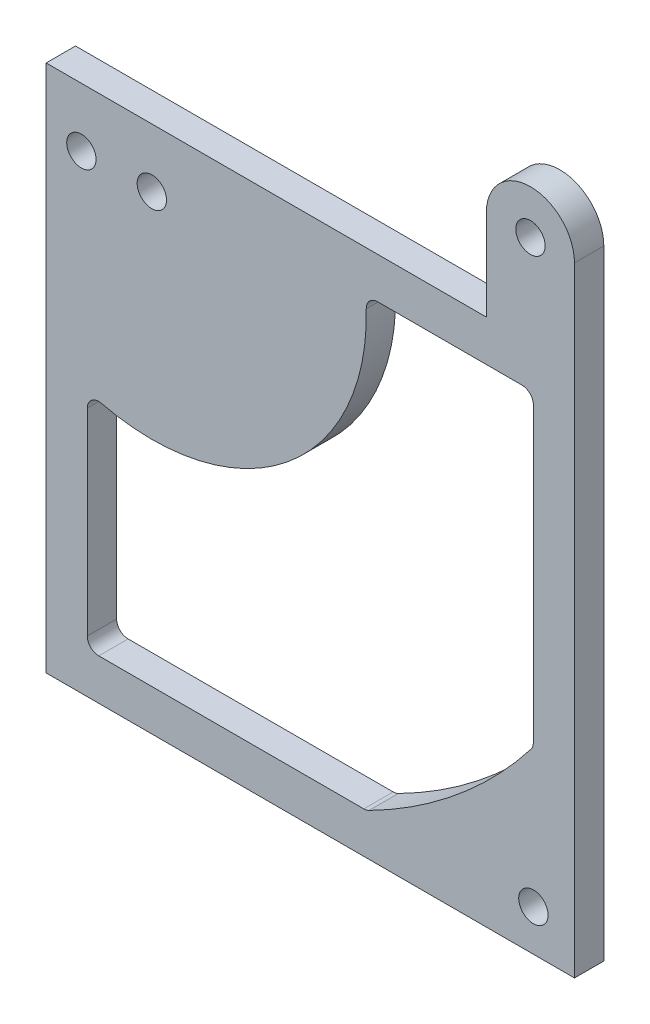
ISO-10303-21;
HEADER;
FILE_DESCRIPTION(('STEP AP214'),'2;1');
FILE_NAME('part.step','',(''),(''),'','','');
FILE_SCHEMA(('AUTOMOTIVE_DESIGN { 1 0 10303 214 1 1 1 1 }'));
ENDSEC;
DATA;
#1=APPLICATION_CONTEXT('core data for automotive mechanical design processes');
#2=APPLICATION_PROTOCOL_DEFINITION('international standard','automotive_design',2000,#1);
#3=PRODUCT_CONTEXT('',#1,'mechanical');
#4=PRODUCT('Part','Part','',(#3));
#5=PRODUCT_RELATED_PRODUCT_CATEGORY('part','',(#4));
#6=PRODUCT_DEFINITION_FORMATION('','',#4);
#7=PRODUCT_DEFINITION_CONTEXT('part definition',#1,'design');
#8=PRODUCT_DEFINITION('design','',#6,#7);
#9=PRODUCT_DEFINITION_SHAPE('','',#8);
#10=(LENGTH_UNIT() NAMED_UNIT(*) SI_UNIT(.MILLI.,.METRE.));
#11=(NAMED_UNIT(*) PLANE_ANGLE_UNIT() SI_UNIT($,.RADIAN.));
#12=(NAMED_UNIT(*) SI_UNIT($,.STERADIAN.) SOLID_ANGLE_UNIT());
#13=UNCERTAINTY_MEASURE_WITH_UNIT(LENGTH_MEASURE(1.E-05),#10,'distance_accuracy_value','');
#14=(GEOMETRIC_REPRESENTATION_CONTEXT(3) GLOBAL_UNCERTAINTY_ASSIGNED_CONTEXT((#13)) GLOBAL_UNIT_ASSIGNED_CONTEXT((#10,
#11,#12)) REPRESENTATION_CONTEXT('',''));
#15=CARTESIAN_POINT('',(0.,0.,0.));
#16=DIRECTION('',(0.,0.,1.));
#17=DIRECTION('',(1.,0.,0.));
#18=AXIS2_PLACEMENT_3D('',#15,#16,#17);
#19=CARTESIAN_POINT('',(47.625,76.835,3.175));
#20=DIRECTION('',(0.,0.,-1.));
#21=DIRECTION('',(-1.,0.,0.));
#22=AXIS2_PLACEMENT_3D('',#19,#20,#21);
#23=PLANE('',#22);
#24=CARTESIAN_POINT('',(-49.53,44.45,3.175));
#25=DIRECTION('',(0.,0.,1.));
#26=DIRECTION('',(1.,0.,0.));
#27=AXIS2_PLACEMENT_3D('',#24,#25,#26);
#28=CIRCLE('',#27,3.17499999999997);
#29=CARTESIAN_POINT('',(-46.355,44.45,3.175));
#30=VERTEX_POINT('',#29);
#31=EDGE_CURVE('E333',#30,#30,#28,.T.);
#32=ORIENTED_EDGE('',*,*,#31,.F.);
#33=EDGE_LOOP('',(#32));
#34=FACE_BOUND('',#33,.T.);
#35=CARTESIAN_POINT('',(-34.29,44.45,3.175));
#36=DIRECTION('',(0.,0.,1.));
#37=DIRECTION('',(1.,0.,0.));
#38=AXIS2_PLACEMENT_3D('',#35,#36,#37);
#39=CIRCLE('',#38,3.175);
#40=CARTESIAN_POINT('',(-31.115,44.45,3.175));
#41=VERTEX_POINT('',#40);
#42=EDGE_CURVE('E326',#41,#41,#39,.T.);
#43=ORIENTED_EDGE('',*,*,#42,.F.);
#44=EDGE_LOOP('',(#43));
#45=FACE_BOUND('',#44,.T.);
#46=CARTESIAN_POINT('',(47.625,76.835,3.175));
#47=DIRECTION('',(0.,0.,1.));
#48=DIRECTION('',(-1.,0.,0.));
#49=AXIS2_PLACEMENT_3D('',#46,#47,#48);
#50=CIRCLE('',#49,9.525);
#51=CARTESIAN_POINT('',(57.15,76.835,3.175));
#52=VERTEX_POINT('',#51);
#53=CARTESIAN_POINT('',(38.1,76.835,3.175));
#54=VERTEX_POINT('',#53);
#55=EDGE_CURVE('E292',#52,#54,#50,.T.);
#56=ORIENTED_EDGE('',*,*,#55,.T.);
#57=DIRECTION('',(0.,-1.,0.));
#58=VECTOR('',#57,1.);
#59=CARTESIAN_POINT('',(38.1,76.835,3.175));
#60=LINE('',#59,#58);
#61=CARTESIAN_POINT('',(38.1,57.15,3.175));
#62=VERTEX_POINT('',#61);
#63=EDGE_CURVE('E311',#54,#62,#60,.T.);
#64=ORIENTED_EDGE('',*,*,#63,.T.);
#65=DIRECTION('',(-1.,0.,0.));
#66=VECTOR('',#65,1.);
#67=CARTESIAN_POINT('',(-57.15,57.15,3.175));
#68=LINE('',#67,#66);
#69=CARTESIAN_POINT('',(-57.15,57.15,3.175));
#70=VERTEX_POINT('',#69);
#71=EDGE_CURVE('E278',#62,#70,#68,.T.);
#72=ORIENTED_EDGE('',*,*,#71,.T.);
#73=DIRECTION('',(0.,-1.,0.));
#74=VECTOR('',#73,1.);
#75=CARTESIAN_POINT('',(-57.15,-57.15,3.175));
#76=LINE('',#75,#74);
#77=CARTESIAN_POINT('',(-57.15,-57.15,3.175));
#78=VERTEX_POINT('',#77);
#79=EDGE_CURVE('E305',#70,#78,#76,.T.);
#80=ORIENTED_EDGE('',*,*,#79,.T.);
#81=DIRECTION('',(1.,0.,0.));
#82=VECTOR('',#81,1.);
#83=CARTESIAN_POINT('',(-57.15,-57.15,3.175));
#84=LINE('',#83,#82);
#85=CARTESIAN_POINT('',(57.15,-57.15,3.175));
#86=VERTEX_POINT('',#85);
#87=EDGE_CURVE('E308',#78,#86,#84,.T.);
#88=ORIENTED_EDGE('',*,*,#87,.T.);
#89=DIRECTION('',(0.,1.,0.));
#90=VECTOR('',#89,1.);
#91=CARTESIAN_POINT('',(57.15,-57.15,3.175));
#92=LINE('',#91,#90);
#93=EDGE_CURVE('E297',#86,#52,#92,.T.);
#94=ORIENTED_EDGE('',*,*,#93,.T.);
#95=EDGE_LOOP('',(#56,#64,#72,#80,#88,#94));
#96=FACE_BOUND('',#95,.T.);
#97=CARTESIAN_POINT('',(-45.7715239103202,-3.07659926776489,3.175));
#98=DIRECTION('',(0.,0.,1.));
#99=DIRECTION('',(1.,0.,0.));
#100=AXIS2_PLACEMENT_3D('',#97,#98,#99);
#101=CIRCLE('',#100,2.48847608967975);
#102=CARTESIAN_POINT('',(-45.1871655335266,-0.657707261829316,3.175));
#103=VERTEX_POINT('',#102);
#104=CARTESIAN_POINT('',(-48.26,-3.07659926776489,3.175));
#105=VERTEX_POINT('',#104);
#106=EDGE_CURVE('E165',#103,#105,#101,.T.);
#107=ORIENTED_EDGE('',*,*,#106,.F.);
#108=CARTESIAN_POINT('',(-34.29,44.45,3.175));
#109=DIRECTION('',(0.,0.,-1.));
#110=DIRECTION('',(1.,0.,0.));
#111=AXIS2_PLACEMENT_3D('',#108,#109,#110);
#112=CIRCLE('',#111,46.4053172716659);
#113=CARTESIAN_POINT('',(12.0983637598057,45.704264235284,3.175));
#114=VERTEX_POINT('',#113);
#115=EDGE_CURVE('E372',#114,#103,#112,.T.);
#116=ORIENTED_EDGE('',*,*,#115,.F.);
#117=CARTESIAN_POINT('',(14.5859307207179,45.7715239103202,3.175));
#118=DIRECTION('',(0.,0.,1.));
#119=DIRECTION('',(-1.,0.,0.));
#120=AXIS2_PLACEMENT_3D('',#117,#118,#119);
#121=CIRCLE('',#120,2.48847608967976);
#122=CARTESIAN_POINT('',(14.5859307207179,48.26,3.175));
#123=VERTEX_POINT('',#122);
#124=EDGE_CURVE('E406',#123,#114,#121,.T.);
#125=ORIENTED_EDGE('',*,*,#124,.F.);
#126=DIRECTION('',(-1.,0.,0.));
#127=VECTOR('',#126,1.);
#128=CARTESIAN_POINT('',(14.5859307207179,48.26,3.175));
#129=LINE('',#128,#127);
#130=CARTESIAN_POINT('',(45.7715239103202,48.26,3.175));
#131=VERTEX_POINT('',#130);
#132=EDGE_CURVE('E414',#131,#123,#129,.T.);
#133=ORIENTED_EDGE('',*,*,#132,.F.);
#134=CARTESIAN_POINT('',(45.7715239103202,45.7715239103202,3.175));
#135=DIRECTION('',(0.,0.,1.));
#136=DIRECTION('',(-1.,0.,0.));
#137=AXIS2_PLACEMENT_3D('',#134,#135,#136);
#138=CIRCLE('',#137,2.48847608967976);
#139=CARTESIAN_POINT('',(48.2599999999999,45.7715239103202,3.175));
#140=VERTEX_POINT('',#139);
#141=EDGE_CURVE('E416',#140,#131,#138,.T.);
#142=ORIENTED_EDGE('',*,*,#141,.F.);
#143=DIRECTION('',(0.,1.,0.));
#144=VECTOR('',#143,1.);
#145=CARTESIAN_POINT('',(48.26,-17.4505972638445,3.175));
#146=LINE('',#145,#144);
#147=CARTESIAN_POINT('',(48.26,-17.4505972638445,3.175));
#148=VERTEX_POINT('',#147);
#149=EDGE_CURVE('E419',#148,#140,#146,.T.);
#150=ORIENTED_EDGE('',*,*,#149,.F.);
#151=CARTESIAN_POINT('',(45.7715239103202,-17.4505972638445,3.175));
#152=DIRECTION('',(0.,0.,1.));
#153=DIRECTION('',(-1.,0.,0.));
#154=AXIS2_PLACEMENT_3D('',#151,#152,#153);
#155=CIRCLE('',#154,2.48847608967975);
#156=CARTESIAN_POINT('',(47.7402027389286,-18.9727066287381,3.175));
#157=VERTEX_POINT('',#156);
#158=EDGE_CURVE('E422',#157,#148,#155,.T.);
#159=ORIENTED_EDGE('',*,*,#158,.F.);
#160=CARTESIAN_POINT('',(-34.29,44.45,3.175));
#161=DIRECTION('',(0.,0.,1.));
#162=DIRECTION('',(1.,0.,0.));
#163=AXIS2_PLACEMENT_3D('',#160,#161,#162);
#164=CIRCLE('',#163,103.688928422974);
#165=CARTESIAN_POINT('',(12.6995451600385,-47.9803874445921,3.175));
#166=VERTEX_POINT('',#165);
#167=EDGE_CURVE('E429',#166,#157,#164,.T.);
#168=ORIENTED_EDGE('',*,*,#167,.F.);
#169=CARTESIAN_POINT('',(11.5718224477477,-45.7621100198566,3.175));
#170=DIRECTION('',(0.,0.,1.));
#171=DIRECTION('',(-1.,0.,0.));
#172=AXIS2_PLACEMENT_3D('',#169,#170,#171);
#173=CIRCLE('',#172,2.48847608967976);
#174=CARTESIAN_POINT('',(11.5718224477477,-48.2505861095364,3.175));
#175=VERTEX_POINT('',#174);
#176=EDGE_CURVE('E431',#175,#166,#173,.T.);
#177=ORIENTED_EDGE('',*,*,#176,.F.);
#178=DIRECTION('',(1.,0.,0.));
#179=VECTOR('',#178,1.);
#180=CARTESIAN_POINT('',(-45.7715239103202,-48.2505861095364,3.175));
#181=LINE('',#180,#179);
#182=CARTESIAN_POINT('',(-45.7715239103202,-48.2505861095364,3.175));
#183=VERTEX_POINT('',#182);
#184=EDGE_CURVE('E189',#183,#175,#181,.T.);
#185=ORIENTED_EDGE('',*,*,#184,.F.);
#186=CARTESIAN_POINT('',(-45.7715239103202,-45.7621100198566,3.175));
#187=DIRECTION('',(0.,0.,1.));
#188=DIRECTION('',(-1.,0.,0.));
#189=AXIS2_PLACEMENT_3D('',#186,#187,#188);
#190=CIRCLE('',#189,2.48847608967976);
#191=CARTESIAN_POINT('',(-48.26,-45.7621100198566,3.175));
#192=VERTEX_POINT('',#191);
#193=EDGE_CURVE('E187',#192,#183,#190,.T.);
#194=ORIENTED_EDGE('',*,*,#193,.F.);
#195=DIRECTION('',(0.,-1.,0.));
#196=VECTOR('',#195,1.);
#197=CARTESIAN_POINT('',(-48.26,-45.7621100198566,3.175));
#198=LINE('',#197,#196);
#199=EDGE_CURVE('E173',#105,#192,#198,.T.);
#200=ORIENTED_EDGE('',*,*,#199,.F.);
#201=EDGE_LOOP('',(#107,#116,#125,#133,#142,#150,#159,#168,#177,#185,#194,#200));
#202=FACE_BOUND('',#201,.T.);
#203=CARTESIAN_POINT('',(48.26,-48.2505861095364,3.175));
#204=DIRECTION('',(0.,0.,1.));
#205=DIRECTION('',(1.,0.,0.));
#206=AXIS2_PLACEMENT_3D('',#203,#204,#205);
#207=CIRCLE('',#206,3.17499999999999);
#208=CARTESIAN_POINT('',(51.435,-48.2505861095364,3.175));
#209=VERTEX_POINT('',#208);
#210=EDGE_CURVE('E200',#209,#209,#207,.T.);
#211=ORIENTED_EDGE('',*,*,#210,.F.);
#212=EDGE_LOOP('',(#211));
#213=FACE_BOUND('',#212,.T.);
#214=CARTESIAN_POINT('',(47.625,76.835,3.175));
#215=DIRECTION('',(0.,0.,1.));
#216=DIRECTION('',(1.,0.,0.));
#217=AXIS2_PLACEMENT_3D('',#214,#215,#216);
#218=CIRCLE('',#217,3.175);
#219=CARTESIAN_POINT('',(50.8,76.835,3.175));
#220=VERTEX_POINT('',#219);
#221=EDGE_CURVE('E207',#220,#220,#218,.T.);
#222=ORIENTED_EDGE('',*,*,#221,.F.);
#223=EDGE_LOOP('',(#222));
#224=FACE_BOUND('',#223,.T.);
#225=ADVANCED_FACE('F40',(#34,#45,#96,#202,#213,#224),#23,.F.);
#226=CARTESIAN_POINT('',(47.625,76.835,-3.175));
#227=DIRECTION('',(0.,0.,-1.));
#228=DIRECTION('',(-1.,0.,0.));
#229=AXIS2_PLACEMENT_3D('',#226,#227,#228);
#230=PLANE('',#229);
#231=CARTESIAN_POINT('',(48.26,-48.2505861095364,-3.175));
#232=DIRECTION('',(0.,0.,1.));
#233=DIRECTION('',(1.,0.,0.));
#234=AXIS2_PLACEMENT_3D('',#231,#232,#233);
#235=CIRCLE('',#234,3.17499999999999);
#236=CARTESIAN_POINT('',(51.435,-48.2505861095364,-3.175));
#237=VERTEX_POINT('',#236);
#238=EDGE_CURVE('E204',#237,#237,#235,.T.);
#239=ORIENTED_EDGE('',*,*,#238,.T.);
#240=EDGE_LOOP('',(#239));
#241=FACE_BOUND('',#240,.T.);
#242=CARTESIAN_POINT('',(-34.29,44.45,-3.175));
#243=DIRECTION('',(0.,0.,1.));
#244=DIRECTION('',(1.,0.,0.));
#245=AXIS2_PLACEMENT_3D('',#242,#243,#244);
#246=CIRCLE('',#245,3.175);
#247=CARTESIAN_POINT('',(-31.115,44.45,-3.175));
#248=VERTEX_POINT('',#247);
#249=EDGE_CURVE('E328',#248,#248,#246,.T.);
#250=ORIENTED_EDGE('',*,*,#249,.T.);
#251=EDGE_LOOP('',(#250));
#252=FACE_BOUND('',#251,.T.);
#253=CARTESIAN_POINT('',(47.625,76.835,-3.175));
#254=DIRECTION('',(0.,0.,1.));
#255=DIRECTION('',(-1.,0.,0.));
#256=AXIS2_PLACEMENT_3D('',#253,#254,#255);
#257=CIRCLE('',#256,9.525);
#258=CARTESIAN_POINT('',(57.15,76.835,-3.175));
#259=VERTEX_POINT('',#258);
#260=CARTESIAN_POINT('',(38.1,76.835,-3.175));
#261=VERTEX_POINT('',#260);
#262=EDGE_CURVE('E274',#259,#261,#257,.T.);
#263=ORIENTED_EDGE('',*,*,#262,.F.);
#264=DIRECTION('',(0.,1.,0.));
#265=VECTOR('',#264,1.);
#266=CARTESIAN_POINT('',(57.15,-57.15,-3.175));
#267=LINE('',#266,#265);
#268=CARTESIAN_POINT('',(57.15,-57.15,-3.175));
#269=VERTEX_POINT('',#268);
#270=EDGE_CURVE('E290',#269,#259,#267,.T.);
#271=ORIENTED_EDGE('',*,*,#270,.F.);
#272=DIRECTION('',(1.,0.,0.));
#273=VECTOR('',#272,1.);
#274=CARTESIAN_POINT('',(-57.15,-57.15,-3.175));
#275=LINE('',#274,#273);
#276=CARTESIAN_POINT('',(-57.15,-57.15,-3.175));
#277=VERTEX_POINT('',#276);
#278=EDGE_CURVE('E285',#277,#269,#275,.T.);
#279=ORIENTED_EDGE('',*,*,#278,.F.);
#280=DIRECTION('',(0.,-1.,0.));
#281=VECTOR('',#280,1.);
#282=CARTESIAN_POINT('',(-57.15,-57.15,-3.175));
#283=LINE('',#282,#281);
#284=CARTESIAN_POINT('',(-57.15,57.15,-3.175));
#285=VERTEX_POINT('',#284);
#286=EDGE_CURVE('E283',#285,#277,#283,.T.);
#287=ORIENTED_EDGE('',*,*,#286,.F.);
#288=DIRECTION('',(-1.,0.,0.));
#289=VECTOR('',#288,1.);
#290=CARTESIAN_POINT('',(-57.15,57.15,-3.175));
#291=LINE('',#290,#289);
#292=CARTESIAN_POINT('',(38.1,57.15,-3.175));
#293=VERTEX_POINT('',#292);
#294=EDGE_CURVE('E273',#293,#285,#291,.T.);
#295=ORIENTED_EDGE('',*,*,#294,.F.);
#296=DIRECTION('',(0.,-1.,0.));
#297=VECTOR('',#296,1.);
#298=CARTESIAN_POINT('',(38.1,76.835,-3.175));
#299=LINE('',#298,#297);
#300=EDGE_CURVE('E265',#261,#293,#299,.T.);
#301=ORIENTED_EDGE('',*,*,#300,.F.);
#302=EDGE_LOOP('',(#263,#271,#279,#287,#295,#301));
#303=FACE_BOUND('',#302,.T.);
#304=CARTESIAN_POINT('',(-49.53,44.45,-3.175));
#305=DIRECTION('',(0.,0.,1.));
#306=DIRECTION('',(1.,0.,0.));
#307=AXIS2_PLACEMENT_3D('',#304,#305,#306);
#308=CIRCLE('',#307,3.17499999999997);
#309=CARTESIAN_POINT('',(-46.355,44.45,-3.175));
#310=VERTEX_POINT('',#309);
#311=EDGE_CURVE('E181',#310,#310,#308,.T.);
#312=ORIENTED_EDGE('',*,*,#311,.T.);
#313=EDGE_LOOP('',(#312));
#314=FACE_BOUND('',#313,.T.);
#315=CARTESIAN_POINT('',(-34.29,44.45,-3.175));
#316=DIRECTION('',(0.,0.,-1.));
#317=DIRECTION('',(1.,0.,0.));
#318=AXIS2_PLACEMENT_3D('',#315,#316,#317);
#319=CIRCLE('',#318,46.4053172716659);
#320=CARTESIAN_POINT('',(12.0983637598057,45.704264235284,-3.175));
#321=VERTEX_POINT('',#320);
#322=CARTESIAN_POINT('',(-45.1871655335266,-0.657707261829316,-3.175));
#323=VERTEX_POINT('',#322);
#324=EDGE_CURVE('E174',#321,#323,#319,.T.);
#325=ORIENTED_EDGE('',*,*,#324,.T.);
#326=CARTESIAN_POINT('',(-45.7715239103202,-3.07659926776489,-3.175));
#327=DIRECTION('',(0.,0.,1.));
#328=DIRECTION('',(1.,0.,0.));
#329=AXIS2_PLACEMENT_3D('',#326,#327,#328);
#330=CIRCLE('',#329,2.48847608967975);
#331=CARTESIAN_POINT('',(-48.26,-3.07659926776489,-3.175));
#332=VERTEX_POINT('',#331);
#333=EDGE_CURVE('E63',#323,#332,#330,.T.);
#334=ORIENTED_EDGE('',*,*,#333,.T.);
#335=DIRECTION('',(0.,-1.,0.));
#336=VECTOR('',#335,1.);
#337=CARTESIAN_POINT('',(-48.26,-45.7621100198566,-3.175));
#338=LINE('',#337,#336);
#339=CARTESIAN_POINT('',(-48.26,-45.7621100198566,-3.175));
#340=VERTEX_POINT('',#339);
#341=EDGE_CURVE('E180',#332,#340,#338,.T.);
#342=ORIENTED_EDGE('',*,*,#341,.T.);
#343=CARTESIAN_POINT('',(-45.7715239103202,-45.7621100198566,-3.175));
#344=DIRECTION('',(0.,0.,1.));
#345=DIRECTION('',(-1.,0.,0.));
#346=AXIS2_PLACEMENT_3D('',#343,#344,#345);
#347=CIRCLE('',#346,2.48847608967976);
#348=CARTESIAN_POINT('',(-45.7715239103202,-48.2505861095364,-3.175));
#349=VERTEX_POINT('',#348);
#350=EDGE_CURVE('E399',#340,#349,#347,.T.);
#351=ORIENTED_EDGE('',*,*,#350,.T.);
#352=DIRECTION('',(1.,0.,0.));
#353=VECTOR('',#352,1.);
#354=CARTESIAN_POINT('',(-45.7715239103202,-48.2505861095364,-3.175));
#355=LINE('',#354,#353);
#356=CARTESIAN_POINT('',(11.5718224477477,-48.2505861095364,-3.175));
#357=VERTEX_POINT('',#356);
#358=EDGE_CURVE('E396',#349,#357,#355,.T.);
#359=ORIENTED_EDGE('',*,*,#358,.T.);
#360=CARTESIAN_POINT('',(11.5718224477477,-45.7621100198566,-3.175));
#361=DIRECTION('',(0.,0.,1.));
#362=DIRECTION('',(-1.,0.,0.));
#363=AXIS2_PLACEMENT_3D('',#360,#361,#362);
#364=CIRCLE('',#363,2.48847608967976);
#365=CARTESIAN_POINT('',(12.6995451600385,-47.9803874445921,-3.175));
#366=VERTEX_POINT('',#365);
#367=EDGE_CURVE('E393',#357,#366,#364,.T.);
#368=ORIENTED_EDGE('',*,*,#367,.T.);
#369=CARTESIAN_POINT('',(-34.29,44.45,-3.175));
#370=DIRECTION('',(0.,0.,1.));
#371=DIRECTION('',(1.,0.,0.));
#372=AXIS2_PLACEMENT_3D('',#369,#370,#371);
#373=CIRCLE('',#372,103.688928422974);
#374=CARTESIAN_POINT('',(47.7402027389286,-18.9727066287381,-3.175));
#375=VERTEX_POINT('',#374);
#376=EDGE_CURVE('E390',#366,#375,#373,.T.);
#377=ORIENTED_EDGE('',*,*,#376,.T.);
#378=CARTESIAN_POINT('',(45.7715239103202,-17.4505972638445,-3.175));
#379=DIRECTION('',(0.,0.,1.));
#380=DIRECTION('',(-1.,0.,0.));
#381=AXIS2_PLACEMENT_3D('',#378,#379,#380);
#382=CIRCLE('',#381,2.48847608967975);
#383=CARTESIAN_POINT('',(48.26,-17.4505972638445,-3.175));
#384=VERTEX_POINT('',#383);
#385=EDGE_CURVE('E387',#375,#384,#382,.T.);
#386=ORIENTED_EDGE('',*,*,#385,.T.);
#387=DIRECTION('',(0.,1.,0.));
#388=VECTOR('',#387,1.);
#389=CARTESIAN_POINT('',(48.26,-17.4505972638445,-3.175));
#390=LINE('',#389,#388);
#391=CARTESIAN_POINT('',(48.2599999999999,45.7715239103202,-3.175));
#392=VERTEX_POINT('',#391);
#393=EDGE_CURVE('E384',#384,#392,#390,.T.);
#394=ORIENTED_EDGE('',*,*,#393,.T.);
#395=CARTESIAN_POINT('',(45.7715239103202,45.7715239103202,-3.175));
#396=DIRECTION('',(0.,0.,1.));
#397=DIRECTION('',(-1.,0.,0.));
#398=AXIS2_PLACEMENT_3D('',#395,#396,#397);
#399=CIRCLE('',#398,2.48847608967976);
#400=CARTESIAN_POINT('',(45.7715239103202,48.26,-3.175));
#401=VERTEX_POINT('',#400);
#402=EDGE_CURVE('E381',#392,#401,#399,.T.);
#403=ORIENTED_EDGE('',*,*,#402,.T.);
#404=DIRECTION('',(-1.,0.,0.));
#405=VECTOR('',#404,1.);
#406=CARTESIAN_POINT('',(14.5859307207179,48.26,-3.175));
#407=LINE('',#406,#405);
#408=CARTESIAN_POINT('',(14.5859307207179,48.26,-3.175));
#409=VERTEX_POINT('',#408);
#410=EDGE_CURVE('E378',#401,#409,#407,.T.);
#411=ORIENTED_EDGE('',*,*,#410,.T.);
#412=CARTESIAN_POINT('',(14.5859307207179,45.7715239103202,-3.175));
#413=DIRECTION('',(0.,0.,1.));
#414=DIRECTION('',(-1.,0.,0.));
#415=AXIS2_PLACEMENT_3D('',#412,#413,#414);
#416=CIRCLE('',#415,2.48847608967976);
#417=EDGE_CURVE('E375',#409,#321,#416,.T.);
#418=ORIENTED_EDGE('',*,*,#417,.T.);
#419=EDGE_LOOP('',(#325,#334,#342,#351,#359,#368,#377,#386,#394,#403,#411,#418));
#420=FACE_BOUND('',#419,.T.);
#421=CARTESIAN_POINT('',(47.625,76.835,-3.175));
#422=DIRECTION('',(0.,0.,1.));
#423=DIRECTION('',(1.,0.,0.));
#424=AXIS2_PLACEMENT_3D('',#421,#422,#423);
#425=CIRCLE('',#424,3.175);
#426=CARTESIAN_POINT('',(50.8,76.835,-3.175));
#427=VERTEX_POINT('',#426);
#428=EDGE_CURVE('E205',#427,#427,#425,.T.);
#429=ORIENTED_EDGE('',*,*,#428,.T.);
#430=EDGE_LOOP('',(#429));
#431=FACE_BOUND('',#430,.T.);
#432=ADVANCED_FACE('F217',(#241,#252,#303,#314,#420,#431),#230,.T.);
#433=CARTESIAN_POINT('',(47.625,76.835,3.175));
#434=DIRECTION('',(0.,0.,-1.));
#435=DIRECTION('',(-1.,0.,0.));
#436=AXIS2_PLACEMENT_3D('',#433,#434,#435);
#437=CYLINDRICAL_SURFACE('',#436,9.525);
#438=ORIENTED_EDGE('',*,*,#262,.T.);
#439=DIRECTION('',(0.,0.,-1.));
#440=VECTOR('',#439,1.);
#441=CARTESIAN_POINT('',(38.1,76.835,3.175));
#442=LINE('',#441,#440);
#443=EDGE_CURVE('E12',#54,#261,#442,.T.);
#444=ORIENTED_EDGE('',*,*,#443,.F.);
#445=ORIENTED_EDGE('',*,*,#55,.F.);
#446=DIRECTION('',(0.,0.,-1.));
#447=VECTOR('',#446,1.);
#448=CARTESIAN_POINT('',(57.15,76.835,3.175));
#449=LINE('',#448,#447);
#450=EDGE_CURVE('E293',#52,#259,#449,.T.);
#451=ORIENTED_EDGE('',*,*,#450,.T.);
#452=EDGE_LOOP('',(#438,#444,#445,#451));
#453=FACE_BOUND('',#452,.T.);
#454=ADVANCED_FACE('F42',(#453),#437,.T.);
#455=CARTESIAN_POINT('',(38.1,76.835,3.175));
#456=DIRECTION('',(1.,0.,0.));
#457=DIRECTION('',(0.,1.,0.));
#458=AXIS2_PLACEMENT_3D('',#455,#456,#457);
#459=PLANE('',#458);
#460=ORIENTED_EDGE('',*,*,#300,.T.);
#461=DIRECTION('',(0.,0.,-1.));
#462=VECTOR('',#461,1.);
#463=CARTESIAN_POINT('',(38.1,57.15,3.175));
#464=LINE('',#463,#462);
#465=EDGE_CURVE('E48',#62,#293,#464,.T.);
#466=ORIENTED_EDGE('',*,*,#465,.F.);
#467=ORIENTED_EDGE('',*,*,#63,.F.);
#468=ORIENTED_EDGE('',*,*,#443,.T.);
#469=EDGE_LOOP('',(#460,#466,#467,#468));
#470=FACE_BOUND('',#469,.T.);
#471=ADVANCED_FACE('F256',(#470),#459,.F.);
#472=CARTESIAN_POINT('',(-57.15,57.15,3.175));
#473=DIRECTION('',(0.,-1.,0.));
#474=DIRECTION('',(1.,0.,0.));
#475=AXIS2_PLACEMENT_3D('',#472,#473,#474);
#476=PLANE('',#475);
#477=ORIENTED_EDGE('',*,*,#294,.T.);
#478=DIRECTION('',(0.,0.,-1.));
#479=VECTOR('',#478,1.);
#480=CARTESIAN_POINT('',(-57.15,57.15,3.175));
#481=LINE('',#480,#479);
#482=EDGE_CURVE('E279',#70,#285,#481,.T.);
#483=ORIENTED_EDGE('',*,*,#482,.F.);
#484=ORIENTED_EDGE('',*,*,#71,.F.);
#485=ORIENTED_EDGE('',*,*,#465,.T.);
#486=EDGE_LOOP('',(#477,#483,#484,#485));
#487=FACE_BOUND('',#486,.T.);
#488=ADVANCED_FACE('F253',(#487),#476,.F.);
#489=CARTESIAN_POINT('',(-57.15,-57.15,3.175));
#490=DIRECTION('',(1.,0.,0.));
#491=DIRECTION('',(0.,0.,-1.));
#492=AXIS2_PLACEMENT_3D('',#489,#490,#491);
#493=PLANE('',#492);
#494=ORIENTED_EDGE('',*,*,#286,.T.);
#495=DIRECTION('',(0.,0.,-1.));
#496=VECTOR('',#495,1.);
#497=CARTESIAN_POINT('',(-57.15,-57.15,3.175));
#498=LINE('',#497,#496);
#499=EDGE_CURVE('E300',#78,#277,#498,.T.);
#500=ORIENTED_EDGE('',*,*,#499,.F.);
#501=ORIENTED_EDGE('',*,*,#79,.F.);
#502=ORIENTED_EDGE('',*,*,#482,.T.);
#503=EDGE_LOOP('',(#494,#500,#501,#502));
#504=FACE_BOUND('',#503,.T.);
#505=ADVANCED_FACE('F249',(#504),#493,.F.);
#506=CARTESIAN_POINT('',(-57.15,-57.15,3.175));
#507=DIRECTION('',(0.,1.,0.));
#508=DIRECTION('',(0.,0.,1.));
#509=AXIS2_PLACEMENT_3D('',#506,#507,#508);
#510=PLANE('',#509);
#511=ORIENTED_EDGE('',*,*,#278,.T.);
#512=DIRECTION('',(0.,0.,-1.));
#513=VECTOR('',#512,1.);
#514=CARTESIAN_POINT('',(57.15,-57.15,3.175));
#515=LINE('',#514,#513);
#516=EDGE_CURVE('E296',#86,#269,#515,.T.);
#517=ORIENTED_EDGE('',*,*,#516,.F.);
#518=ORIENTED_EDGE('',*,*,#87,.F.);
#519=ORIENTED_EDGE('',*,*,#499,.T.);
#520=EDGE_LOOP('',(#511,#517,#518,#519));
#521=FACE_BOUND('',#520,.T.);
#522=ADVANCED_FACE('F245',(#521),#510,.F.);
#523=CARTESIAN_POINT('',(57.15,-57.15,3.175));
#524=DIRECTION('',(-1.,0.,0.));
#525=DIRECTION('',(0.,-1.,0.));
#526=AXIS2_PLACEMENT_3D('',#523,#524,#525);
#527=PLANE('',#526);
#528=ORIENTED_EDGE('',*,*,#270,.T.);
#529=ORIENTED_EDGE('',*,*,#450,.F.);
#530=ORIENTED_EDGE('',*,*,#93,.F.);
#531=ORIENTED_EDGE('',*,*,#516,.T.);
#532=EDGE_LOOP('',(#528,#529,#530,#531));
#533=FACE_BOUND('',#532,.T.);
#534=ADVANCED_FACE('F242',(#533),#527,.F.);
#535=CARTESIAN_POINT('',(-34.29,44.45,3.175));
#536=DIRECTION('',(0.,0.,-1.));
#537=DIRECTION('',(-1.,0.,0.));
#538=AXIS2_PLACEMENT_3D('',#535,#536,#537);
#539=CYLINDRICAL_SURFACE('',#538,3.175);
#540=ORIENTED_EDGE('',*,*,#42,.T.);
#541=EDGE_LOOP('',(#540));
#542=FACE_BOUND('',#541,.T.);
#543=ORIENTED_EDGE('',*,*,#249,.F.);
#544=EDGE_LOOP('',(#543));
#545=FACE_BOUND('',#544,.T.);
#546=ADVANCED_FACE('F239',(#542,#545),#539,.F.);
#547=CARTESIAN_POINT('',(-49.53,44.45,3.175));
#548=DIRECTION('',(0.,0.,-1.));
#549=DIRECTION('',(-1.,0.,0.));
#550=AXIS2_PLACEMENT_3D('',#547,#548,#549);
#551=CYLINDRICAL_SURFACE('',#550,3.17499999999997);
#552=ORIENTED_EDGE('',*,*,#31,.T.);
#553=EDGE_LOOP('',(#552));
#554=FACE_BOUND('',#553,.T.);
#555=ORIENTED_EDGE('',*,*,#311,.F.);
#556=EDGE_LOOP('',(#555));
#557=FACE_BOUND('',#556,.T.);
#558=ADVANCED_FACE('F471',(#554,#557),#551,.F.);
#559=CARTESIAN_POINT('',(-45.7715239103202,-3.07659926776489,3.175));
#560=DIRECTION('',(0.,0.,-1.));
#561=DIRECTION('',(-1.,0.,0.));
#562=AXIS2_PLACEMENT_3D('',#559,#560,#561);
#563=CYLINDRICAL_SURFACE('',#562,2.48847608967975);
#564=ORIENTED_EDGE('',*,*,#333,.F.);
#565=DIRECTION('',(0.,0.,-1.));
#566=VECTOR('',#565,1.);
#567=CARTESIAN_POINT('',(-45.1871655335266,-0.657707261829316,3.175));
#568=LINE('',#567,#566);
#569=EDGE_CURVE('E169',#103,#323,#568,.T.);
#570=ORIENTED_EDGE('',*,*,#569,.F.);
#571=ORIENTED_EDGE('',*,*,#106,.T.);
#572=DIRECTION('',(0.,0.,-1.));
#573=VECTOR('',#572,1.);
#574=CARTESIAN_POINT('',(-48.26,-3.07659926776489,3.175));
#575=LINE('',#574,#573);
#576=EDGE_CURVE('E168',#105,#332,#575,.T.);
#577=ORIENTED_EDGE('',*,*,#576,.T.);
#578=EDGE_LOOP('',(#564,#570,#571,#577));
#579=FACE_BOUND('',#578,.T.);
#580=ADVANCED_FACE('F167',(#579),#563,.F.);
#581=CARTESIAN_POINT('',(-48.26,-45.7621100198566,3.175));
#582=DIRECTION('',(1.,0.,0.));
#583=DIRECTION('',(0.,0.,-1.));
#584=AXIS2_PLACEMENT_3D('',#581,#582,#583);
#585=PLANE('',#584);
#586=ORIENTED_EDGE('',*,*,#341,.F.);
#587=ORIENTED_EDGE('',*,*,#576,.F.);
#588=ORIENTED_EDGE('',*,*,#199,.T.);
#589=DIRECTION('',(0.,0.,-1.));
#590=VECTOR('',#589,1.);
#591=CARTESIAN_POINT('',(-48.26,-45.7621100198566,3.175));
#592=LINE('',#591,#590);
#593=EDGE_CURVE('E182',#192,#340,#592,.T.);
#594=ORIENTED_EDGE('',*,*,#593,.T.);
#595=EDGE_LOOP('',(#586,#587,#588,#594));
#596=FACE_BOUND('',#595,.T.);
#597=ADVANCED_FACE('F177',(#596),#585,.T.);
#598=CARTESIAN_POINT('',(-45.7715239103202,-45.7621100198566,3.175));
#599=DIRECTION('',(0.,0.,-1.));
#600=DIRECTION('',(-1.,0.,0.));
#601=AXIS2_PLACEMENT_3D('',#598,#599,#600);
#602=CYLINDRICAL_SURFACE('',#601,2.48847608967976);
#603=ORIENTED_EDGE('',*,*,#350,.F.);
#604=ORIENTED_EDGE('',*,*,#593,.F.);
#605=ORIENTED_EDGE('',*,*,#193,.T.);
#606=DIRECTION('',(0.,0.,-1.));
#607=VECTOR('',#606,1.);
#608=CARTESIAN_POINT('',(-45.7715239103202,-48.2505861095364,3.175));
#609=LINE('',#608,#607);
#610=EDGE_CURVE('E354',#183,#349,#609,.T.);
#611=ORIENTED_EDGE('',*,*,#610,.T.);
#612=EDGE_LOOP('',(#603,#604,#605,#611));
#613=FACE_BOUND('',#612,.T.);
#614=ADVANCED_FACE('F459',(#613),#602,.F.);
#615=CARTESIAN_POINT('',(-45.7715239103202,-48.2505861095364,3.175));
#616=DIRECTION('',(0.,1.,0.));
#617=DIRECTION('',(0.,0.,1.));
#618=AXIS2_PLACEMENT_3D('',#615,#616,#617);
#619=PLANE('',#618);
#620=ORIENTED_EDGE('',*,*,#358,.F.);
#621=ORIENTED_EDGE('',*,*,#610,.F.);
#622=ORIENTED_EDGE('',*,*,#184,.T.);
#623=DIRECTION('',(0.,0.,-1.));
#624=VECTOR('',#623,1.);
#625=CARTESIAN_POINT('',(11.5718224477477,-48.2505861095364,3.175));
#626=LINE('',#625,#624);
#627=EDGE_CURVE('E356',#175,#357,#626,.T.);
#628=ORIENTED_EDGE('',*,*,#627,.T.);
#629=EDGE_LOOP('',(#620,#621,#622,#628));
#630=FACE_BOUND('',#629,.T.);
#631=ADVANCED_FACE('F438',(#630),#619,.T.);
#632=CARTESIAN_POINT('',(11.5718224477477,-45.7621100198566,3.175));
#633=DIRECTION('',(0.,0.,-1.));
#634=DIRECTION('',(-1.,0.,0.));
#635=AXIS2_PLACEMENT_3D('',#632,#633,#634);
#636=CYLINDRICAL_SURFACE('',#635,2.48847608967976);
#637=ORIENTED_EDGE('',*,*,#367,.F.);
#638=ORIENTED_EDGE('',*,*,#627,.F.);
#639=ORIENTED_EDGE('',*,*,#176,.T.);
#640=DIRECTION('',(0.,0.,-1.));
#641=VECTOR('',#640,1.);
#642=CARTESIAN_POINT('',(12.6995451600385,-47.9803874445921,3.175));
#643=LINE('',#642,#641);
#644=EDGE_CURVE('E358',#166,#366,#643,.T.);
#645=ORIENTED_EDGE('',*,*,#644,.T.);
#646=EDGE_LOOP('',(#637,#638,#639,#645));
#647=FACE_BOUND('',#646,.T.);
#648=ADVANCED_FACE('F442',(#647),#636,.F.);
#649=CARTESIAN_POINT('',(-34.29,44.45,3.175));
#650=DIRECTION('',(0.,0.,-1.));
#651=DIRECTION('',(-1.,0.,0.));
#652=AXIS2_PLACEMENT_3D('',#649,#650,#651);
#653=CYLINDRICAL_SURFACE('',#652,103.688928422974);
#654=ORIENTED_EDGE('',*,*,#376,.F.);
#655=ORIENTED_EDGE('',*,*,#644,.F.);
#656=ORIENTED_EDGE('',*,*,#167,.T.);
#657=DIRECTION('',(0.,0.,-1.));
#658=VECTOR('',#657,1.);
#659=CARTESIAN_POINT('',(47.7402027389286,-18.9727066287381,3.175));
#660=LINE('',#659,#658);
#661=EDGE_CURVE('E360',#157,#375,#660,.T.);
#662=ORIENTED_EDGE('',*,*,#661,.T.);
#663=EDGE_LOOP('',(#654,#655,#656,#662));
#664=FACE_BOUND('',#663,.T.);
#665=ADVANCED_FACE('F450',(#664),#653,.F.);
#666=CARTESIAN_POINT('',(45.7715239103202,-17.4505972638445,3.175));
#667=DIRECTION('',(0.,0.,-1.));
#668=DIRECTION('',(-1.,0.,0.));
#669=AXIS2_PLACEMENT_3D('',#666,#667,#668);
#670=CYLINDRICAL_SURFACE('',#669,2.48847608967975);
#671=ORIENTED_EDGE('',*,*,#385,.F.);
#672=ORIENTED_EDGE('',*,*,#661,.F.);
#673=ORIENTED_EDGE('',*,*,#158,.T.);
#674=DIRECTION('',(0.,0.,-1.));
#675=VECTOR('',#674,1.);
#676=CARTESIAN_POINT('',(48.26,-17.4505972638445,3.175));
#677=LINE('',#676,#675);
#678=EDGE_CURVE('E362',#148,#384,#677,.T.);
#679=ORIENTED_EDGE('',*,*,#678,.T.);
#680=EDGE_LOOP('',(#671,#672,#673,#679));
#681=FACE_BOUND('',#680,.T.);
#682=ADVANCED_FACE('F453',(#681),#670,.F.);
#683=CARTESIAN_POINT('',(48.26,-17.4505972638445,3.175));
#684=DIRECTION('',(-1.,0.,0.));
#685=DIRECTION('',(0.,-1.,0.));
#686=AXIS2_PLACEMENT_3D('',#683,#684,#685);
#687=PLANE('',#686);
#688=ORIENTED_EDGE('',*,*,#393,.F.);
#689=ORIENTED_EDGE('',*,*,#678,.F.);
#690=ORIENTED_EDGE('',*,*,#149,.T.);
#691=DIRECTION('',(0.,0.,-1.));
#692=VECTOR('',#691,1.);
#693=CARTESIAN_POINT('',(48.2599999999999,45.7715239103202,3.175));
#694=LINE('',#693,#692);
#695=EDGE_CURVE('E364',#140,#392,#694,.T.);
#696=ORIENTED_EDGE('',*,*,#695,.T.);
#697=EDGE_LOOP('',(#688,#689,#690,#696));
#698=FACE_BOUND('',#697,.T.);
#699=ADVANCED_FACE('F574',(#698),#687,.T.);
#700=CARTESIAN_POINT('',(45.7715239103202,45.7715239103202,3.175));
#701=DIRECTION('',(0.,0.,-1.));
#702=DIRECTION('',(-1.,0.,0.));
#703=AXIS2_PLACEMENT_3D('',#700,#701,#702);
#704=CYLINDRICAL_SURFACE('',#703,2.48847608967976);
#705=ORIENTED_EDGE('',*,*,#402,.F.);
#706=ORIENTED_EDGE('',*,*,#695,.F.);
#707=ORIENTED_EDGE('',*,*,#141,.T.);
#708=DIRECTION('',(0.,0.,-1.));
#709=VECTOR('',#708,1.);
#710=CARTESIAN_POINT('',(45.7715239103202,48.26,3.175));
#711=LINE('',#710,#709);
#712=EDGE_CURVE('E366',#131,#401,#711,.T.);
#713=ORIENTED_EDGE('',*,*,#712,.T.);
#714=EDGE_LOOP('',(#705,#706,#707,#713));
#715=FACE_BOUND('',#714,.T.);
#716=ADVANCED_FACE('F582',(#715),#704,.F.);
#717=CARTESIAN_POINT('',(14.5859307207179,48.26,3.175));
#718=DIRECTION('',(0.,-1.,0.));
#719=DIRECTION('',(0.,0.,-1.));
#720=AXIS2_PLACEMENT_3D('',#717,#718,#719);
#721=PLANE('',#720);
#722=ORIENTED_EDGE('',*,*,#410,.F.);
#723=ORIENTED_EDGE('',*,*,#712,.F.);
#724=ORIENTED_EDGE('',*,*,#132,.T.);
#725=DIRECTION('',(0.,0.,-1.));
#726=VECTOR('',#725,1.);
#727=CARTESIAN_POINT('',(14.5859307207179,48.26,3.175));
#728=LINE('',#727,#726);
#729=EDGE_CURVE('E368',#123,#409,#728,.T.);
#730=ORIENTED_EDGE('',*,*,#729,.T.);
#731=EDGE_LOOP('',(#722,#723,#724,#730));
#732=FACE_BOUND('',#731,.T.);
#733=ADVANCED_FACE('F591',(#732),#721,.T.);
#734=CARTESIAN_POINT('',(14.5859307207179,45.7715239103202,3.175));
#735=DIRECTION('',(0.,0.,-1.));
#736=DIRECTION('',(-1.,0.,0.));
#737=AXIS2_PLACEMENT_3D('',#734,#735,#736);
#738=CYLINDRICAL_SURFACE('',#737,2.48847608967976);
#739=ORIENTED_EDGE('',*,*,#417,.F.);
#740=ORIENTED_EDGE('',*,*,#729,.F.);
#741=ORIENTED_EDGE('',*,*,#124,.T.);
#742=DIRECTION('',(0.,0.,-1.));
#743=VECTOR('',#742,1.);
#744=CARTESIAN_POINT('',(12.0983637598057,45.704264235284,3.175));
#745=LINE('',#744,#743);
#746=EDGE_CURVE('E55',#114,#321,#745,.T.);
#747=ORIENTED_EDGE('',*,*,#746,.T.);
#748=EDGE_LOOP('',(#739,#740,#741,#747));
#749=FACE_BOUND('',#748,.T.);
#750=ADVANCED_FACE('F600',(#749),#738,.F.);
#751=CARTESIAN_POINT('',(-34.29,44.45,3.175));
#752=DIRECTION('',(0.,0.,-1.));
#753=DIRECTION('',(-1.,0.,0.));
#754=AXIS2_PLACEMENT_3D('',#751,#752,#753);
#755=CYLINDRICAL_SURFACE('',#754,46.4053172716659);
#756=ORIENTED_EDGE('',*,*,#324,.F.);
#757=ORIENTED_EDGE('',*,*,#746,.F.);
#758=ORIENTED_EDGE('',*,*,#115,.T.);
#759=ORIENTED_EDGE('',*,*,#569,.T.);
#760=EDGE_LOOP('',(#756,#757,#758,#759));
#761=FACE_BOUND('',#760,.T.);
#762=ADVANCED_FACE('F226',(#761),#755,.T.);
#763=CARTESIAN_POINT('',(48.26,-48.2505861095364,3.175));
#764=DIRECTION('',(0.,0.,-1.));
#765=DIRECTION('',(-1.,0.,0.));
#766=AXIS2_PLACEMENT_3D('',#763,#764,#765);
#767=CYLINDRICAL_SURFACE('',#766,3.17499999999999);
#768=ORIENTED_EDGE('',*,*,#210,.T.);
#769=EDGE_LOOP('',(#768));
#770=FACE_BOUND('',#769,.T.);
#771=ORIENTED_EDGE('',*,*,#238,.F.);
#772=EDGE_LOOP('',(#771));
#773=FACE_BOUND('',#772,.T.);
#774=ADVANCED_FACE('F221',(#770,#773),#767,.F.);
#775=CARTESIAN_POINT('',(47.625,76.835,3.175));
#776=DIRECTION('',(0.,0.,-1.));
#777=DIRECTION('',(-1.,0.,0.));
#778=AXIS2_PLACEMENT_3D('',#775,#776,#777);
#779=CYLINDRICAL_SURFACE('',#778,3.175);
#780=ORIENTED_EDGE('',*,*,#221,.T.);
#781=EDGE_LOOP('',(#780));
#782=FACE_BOUND('',#781,.T.);
#783=ORIENTED_EDGE('',*,*,#428,.F.);
#784=EDGE_LOOP('',(#783));
#785=FACE_BOUND('',#784,.T.);
#786=ADVANCED_FACE('F219',(#782,#785),#779,.F.);
#787=CLOSED_SHELL('',(#225,#432,#454,#471,#488,#505,#522,#534,#546,#558,#580,#597,#614,#631,
#648,#665,#682,#699,#716,#733,#750,#762,#774,#786));
#788=MANIFOLD_SOLID_BREP('B2',#787);
#789=ADVANCED_BREP_SHAPE_REPRESENTATION('',(#18,#788),#14);
#790=SHAPE_DEFINITION_REPRESENTATION(#9,#789);
ENDSEC;
END-ISO-10303-21;
